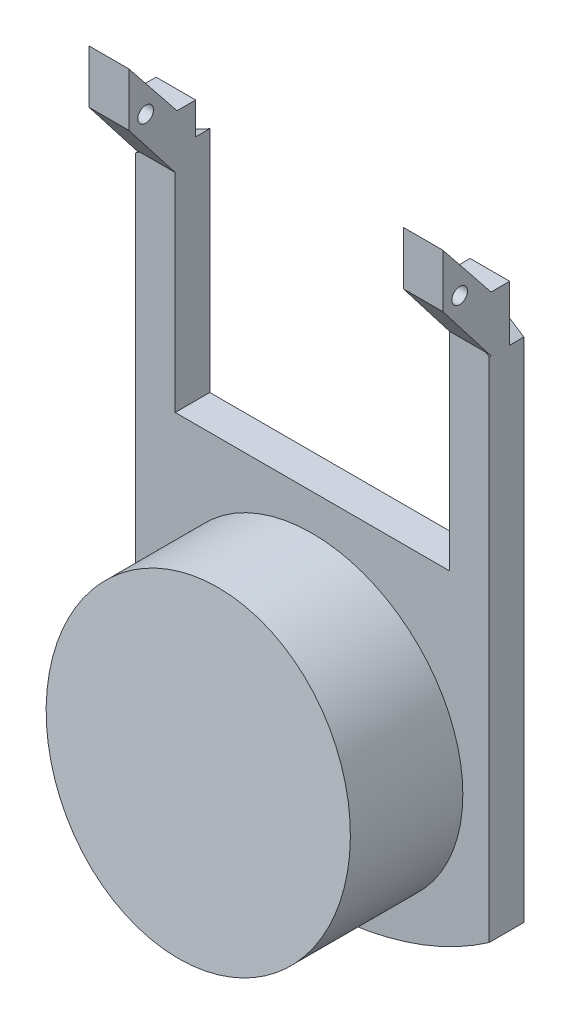
ISO-10303-21;
HEADER;
FILE_DESCRIPTION(('STEP AP214'),'2;1');
FILE_NAME('part.step','',(''),(''),'','','');
FILE_SCHEMA(('AUTOMOTIVE_DESIGN { 1 0 10303 214 1 1 1 1 }'));
ENDSEC;
DATA;
#1=APPLICATION_CONTEXT('core data for automotive mechanical design processes');
#2=APPLICATION_PROTOCOL_DEFINITION('international standard','automotive_design',2000,#1);
#3=PRODUCT_CONTEXT('',#1,'mechanical');
#4=PRODUCT('Part','Part','',(#3));
#5=PRODUCT_RELATED_PRODUCT_CATEGORY('part','',(#4));
#6=PRODUCT_DEFINITION_FORMATION('','',#4);
#7=PRODUCT_DEFINITION_CONTEXT('part definition',#1,'design');
#8=PRODUCT_DEFINITION('design','',#6,#7);
#9=PRODUCT_DEFINITION_SHAPE('','',#8);
#10=(LENGTH_UNIT() NAMED_UNIT(*) SI_UNIT(.MILLI.,.METRE.));
#11=(NAMED_UNIT(*) PLANE_ANGLE_UNIT() SI_UNIT($,.RADIAN.));
#12=(NAMED_UNIT(*) SI_UNIT($,.STERADIAN.) SOLID_ANGLE_UNIT());
#13=UNCERTAINTY_MEASURE_WITH_UNIT(LENGTH_MEASURE(1.E-05),#10,'distance_accuracy_value','');
#14=(GEOMETRIC_REPRESENTATION_CONTEXT(3) GLOBAL_UNCERTAINTY_ASSIGNED_CONTEXT((#13)) GLOBAL_UNIT_ASSIGNED_CONTEXT((#10,
#11,#12)) REPRESENTATION_CONTEXT('',''));
#15=CARTESIAN_POINT('',(0.,0.,0.));
#16=DIRECTION('',(0.,0.,1.));
#17=DIRECTION('',(1.,0.,0.));
#18=AXIS2_PLACEMENT_3D('',#15,#16,#17);
#19=CARTESIAN_POINT('',(14.097,6.0508127340824,3.556));
#20=DIRECTION('',(0.,0.,-1.));
#21=DIRECTION('',(-1.,0.,0.));
#22=AXIS2_PLACEMENT_3D('',#19,#20,#21);
#23=CYLINDRICAL_SURFACE('',#22,31.75);
#24=DIRECTION('',(0.,0.,-1.));
#25=VECTOR('',#24,1.);
#26=CARTESIAN_POINT('',(32.258,32.0938651473461,3.556));
#27=LINE('',#26,#25);
#28=CARTESIAN_POINT('',(32.258,32.0938651473461,3.556));
#29=VERTEX_POINT('',#28);
#30=CARTESIAN_POINT('',(32.258,32.0938651473461,3.36579521219438));
#31=VERTEX_POINT('',#30);
#32=EDGE_CURVE('E321',#29,#31,#27,.T.);
#33=ORIENTED_EDGE('',*,*,#32,.T.);
#34=CARTESIAN_POINT('',(14.097,6.0508127340824,-16.7318144543323));
#35=DIRECTION('',(0.,-0.610941706453606,0.791675584640297));
#36=DIRECTION('',(0.,-0.791675584640297,-0.610941706453606));
#37=AXIS2_PLACEMENT_3D('',#34,#35,#36);
#38=ELLIPSE('',#37,40.1048113848627,31.75);
#39=CARTESIAN_POINT('',(31.8993415970083,32.3403379040703,3.556));
#40=VERTEX_POINT('',#39);
#41=EDGE_CURVE('E223',#31,#40,#38,.T.);
#42=ORIENTED_EDGE('',*,*,#41,.T.);
#43=CARTESIAN_POINT('',(14.097,6.0508127340824,3.556));
#44=DIRECTION('',(0.,0.,1.));
#45=DIRECTION('',(1.,0.,0.));
#46=AXIS2_PLACEMENT_3D('',#43,#44,#45);
#47=CIRCLE('',#46,31.75);
#48=EDGE_CURVE('E284',#29,#40,#47,.T.);
#49=ORIENTED_EDGE('',*,*,#48,.F.);
#50=EDGE_LOOP('',(#33,#42,#49));
#51=FACE_BOUND('',#50,.T.);
#52=ADVANCED_FACE('F36',(#51),#23,.T.);
#53=CARTESIAN_POINT('',(14.097,6.0508127340824,3.556));
#54=DIRECTION('',(0.,0.,-1.));
#55=DIRECTION('',(-1.,0.,0.));
#56=AXIS2_PLACEMENT_3D('',#53,#54,#55);
#57=CYLINDRICAL_SURFACE('',#56,31.75);
#58=CARTESIAN_POINT('',(14.097,6.0508127340824,3.556));
#59=DIRECTION('',(0.,0.,1.));
#60=DIRECTION('',(1.,0.,0.));
#61=AXIS2_PLACEMENT_3D('',#58,#59,#60);
#62=CIRCLE('',#61,31.75);
#63=CARTESIAN_POINT('',(-3.64219577134326,32.3829876041146,3.556));
#64=VERTEX_POINT('',#63);
#65=CARTESIAN_POINT('',(-4.064,32.0938651473461,3.556));
#66=VERTEX_POINT('',#65);
#67=EDGE_CURVE('E294',#64,#66,#62,.T.);
#68=ORIENTED_EDGE('',*,*,#67,.F.);
#69=CARTESIAN_POINT('',(14.097,6.0508127340824,-16.9060538690415));
#70=DIRECTION('',(0.,-0.613594400594107,0.789621372278865));
#71=DIRECTION('',(0.,-0.789621372278866,-0.613594400594107));
#72=AXIS2_PLACEMENT_3D('',#69,#70,#71);
#73=ELLIPSE('',#72,40.2091446795174,31.75);
#74=CARTESIAN_POINT('',(-4.00023265049579,32.138217173655,3.36579521219438));
#75=VERTEX_POINT('',#74);
#76=EDGE_CURVE('E265',#64,#75,#73,.T.);
#77=ORIENTED_EDGE('',*,*,#76,.T.);
#78=CARTESIAN_POINT('',(14.097,6.0508127340824,3.36579521219438));
#79=DIRECTION('',(0.,0.,1.));
#80=DIRECTION('',(1.,0.,0.));
#81=AXIS2_PLACEMENT_3D('',#78,#79,#80);
#82=CIRCLE('',#81,31.75);
#83=CARTESIAN_POINT('',(-4.064,32.0938651473461,3.36579521219438));
#84=VERTEX_POINT('',#83);
#85=EDGE_CURVE('E269',#75,#84,#82,.T.);
#86=ORIENTED_EDGE('',*,*,#85,.T.);
#87=DIRECTION('',(0.,0.,-1.));
#88=VECTOR('',#87,1.);
#89=CARTESIAN_POINT('',(-4.064,32.0938651473461,3.556));
#90=LINE('',#89,#88);
#91=EDGE_CURVE('E330',#66,#84,#90,.T.);
#92=ORIENTED_EDGE('',*,*,#91,.F.);
#93=EDGE_LOOP('',(#68,#77,#86,#92));
#94=FACE_BOUND('',#93,.T.);
#95=ADVANCED_FACE('F373',(#94),#57,.T.);
#96=DIRECTION('',(0.,0.,-1.));
#97=VECTOR('',#96,1.);
#98=CARTESIAN_POINT('',(28.194,34.4996631677994,3.556));
#99=LINE('',#98,#97);
#100=CARTESIAN_POINT('',(28.194,34.4996631677994,1.47898621415967));
#101=VERTEX_POINT('',#100);
#102=CARTESIAN_POINT('',(28.194,34.4996631677994,0.));
#103=VERTEX_POINT('',#102);
#104=EDGE_CURVE('E51',#101,#103,#99,.T.);
#105=ORIENTED_EDGE('',*,*,#104,.F.);
#106=CARTESIAN_POINT('',(14.097,6.0508127340824,1.68586371234564));
#107=DIRECTION('',(0.,-0.00727171837656693,-0.999973560706408));
#108=DIRECTION('',(0.,0.999973560706408,-0.00727171837656693));
#109=AXIS2_PLACEMENT_3D('',#106,#107,#108);
#110=ELLIPSE('',#109,31.7508394697665,31.75);
#111=CARTESIAN_POINT('',(32.258,32.0938651473461,1.49648096238409));
#112=VERTEX_POINT('',#111);
#113=EDGE_CURVE('E55',#101,#112,#110,.T.);
#114=ORIENTED_EDGE('',*,*,#113,.T.);
#115=CARTESIAN_POINT('',(32.258,32.0938651473461,0.));
#116=VERTEX_POINT('',#115);
#117=EDGE_CURVE('E302',#112,#116,#27,.T.);
#118=ORIENTED_EDGE('',*,*,#117,.T.);
#119=CARTESIAN_POINT('',(14.097,6.0508127340824,0.));
#120=DIRECTION('',(0.,0.,1.));
#121=DIRECTION('',(1.,0.,0.));
#122=AXIS2_PLACEMENT_3D('',#119,#120,#121);
#123=CIRCLE('',#122,31.75);
#124=EDGE_CURVE('E283',#116,#103,#123,.T.);
#125=ORIENTED_EDGE('',*,*,#124,.T.);
#126=EDGE_LOOP('',(#105,#114,#118,#125));
#127=FACE_BOUND('',#126,.T.);
#128=ADVANCED_FACE('F38',(#127),#23,.T.);
#129=CARTESIAN_POINT('',(28.194,11.0322423654467,3.556));
#130=DIRECTION('',(1.,0.,0.));
#131=DIRECTION('',(0.,0.,-1.));
#132=AXIS2_PLACEMENT_3D('',#129,#130,#131);
#133=PLANE('',#132);
#134=CARTESIAN_POINT('',(28.194,39.0826970216145,6.58685865334384));
#135=DIRECTION('',(1.,0.,0.));
#136=DIRECTION('',(0.,0.,-1.));
#137=AXIS2_PLACEMENT_3D('',#134,#135,#136);
#138=CIRCLE('',#137,0.803296427959981);
#139=CARTESIAN_POINT('',(28.194,39.0826970216145,5.78356222538386));
#140=VERTEX_POINT('',#139);
#141=EDGE_CURVE('E202',#140,#140,#138,.T.);
#142=ORIENTED_EDGE('',*,*,#141,.T.);
#143=EDGE_LOOP('',(#142));
#144=FACE_BOUND('',#143,.T.);
#145=DIRECTION('',(0.,-0.999973560706408,0.00727171837656693));
#146=VECTOR('',#145,1.);
#147=CARTESIAN_POINT('',(28.194,26.6263546687254,1.53624021001197));
#148=LINE('',#147,#146);
#149=CARTESIAN_POINT('',(28.194,37.7822807676453,1.45511531230584));
#150=VERTEX_POINT('',#149);
#151=EDGE_CURVE('E198',#150,#101,#148,.T.);
#152=ORIENTED_EDGE('',*,*,#151,.T.);
#153=ORIENTED_EDGE('',*,*,#104,.T.);
#154=DIRECTION('',(0.,-1.,0.));
#155=VECTOR('',#154,1.);
#156=CARTESIAN_POINT('',(28.194,11.0322423654467,0.));
#157=LINE('',#156,#155);
#158=CARTESIAN_POINT('',(28.194,11.0322423654467,0.));
#159=VERTEX_POINT('',#158);
#160=EDGE_CURVE('E304',#103,#159,#157,.T.);
#161=ORIENTED_EDGE('',*,*,#160,.T.);
#162=DIRECTION('',(0.,0.,-1.));
#163=VECTOR('',#162,1.);
#164=CARTESIAN_POINT('',(28.194,11.0322423654467,3.556));
#165=LINE('',#164,#163);
#166=CARTESIAN_POINT('',(28.194,11.0322423654467,3.556));
#167=VERTEX_POINT('',#166);
#168=EDGE_CURVE('E338',#167,#159,#165,.T.);
#169=ORIENTED_EDGE('',*,*,#168,.F.);
#170=DIRECTION('',(0.,-1.,0.));
#171=VECTOR('',#170,1.);
#172=CARTESIAN_POINT('',(28.194,21.5456631677994,3.556));
#173=LINE('',#172,#171);
#174=CARTESIAN_POINT('',(28.194,32.3403379040703,3.556));
#175=VERTEX_POINT('',#174);
#176=EDGE_CURVE('E287',#175,#167,#173,.T.);
#177=ORIENTED_EDGE('',*,*,#176,.F.);
#178=DIRECTION('',(0.,0.791675584640297,0.610941706453606));
#179=VECTOR('',#178,1.);
#180=CARTESIAN_POINT('',(28.194,38.5154110159254,8.32134805118012));
#181=LINE('',#180,#179);
#182=CARTESIAN_POINT('',(28.194,38.5154110159254,8.32134805118012));
#183=VERTEX_POINT('',#182);
#184=EDGE_CURVE('E211',#175,#183,#181,.T.);
#185=ORIENTED_EDGE('',*,*,#184,.T.);
#186=DIRECTION('',(0.,1.,0.));
#187=VECTOR('',#186,1.);
#188=CARTESIAN_POINT('',(28.194,43.9841745875889,8.32134805118012));
#189=LINE('',#188,#187);
#190=CARTESIAN_POINT('',(28.194,43.9841745875889,8.32134805118012));
#191=VERTEX_POINT('',#190);
#192=EDGE_CURVE('E189',#183,#191,#189,.T.);
#193=ORIENTED_EDGE('',*,*,#192,.T.);
#194=DIRECTION('',(0.,-0.781235037898434,-0.624236986696425));
#195=VECTOR('',#194,1.);
#196=CARTESIAN_POINT('',(28.194,37.7822807676453,3.36579521219438));
#197=LINE('',#196,#195);
#198=CARTESIAN_POINT('',(28.194,37.7822807676453,3.36579521219438));
#199=VERTEX_POINT('',#198);
#200=EDGE_CURVE('E183',#191,#199,#197,.T.);
#201=ORIENTED_EDGE('',*,*,#200,.T.);
#202=DIRECTION('',(0.,0.,-1.));
#203=VECTOR('',#202,1.);
#204=CARTESIAN_POINT('',(28.194,37.7822807676453,1.45511531230584));
#205=LINE('',#204,#203);
#206=EDGE_CURVE('E192',#199,#150,#205,.T.);
#207=ORIENTED_EDGE('',*,*,#206,.T.);
#208=EDGE_LOOP('',(#152,#153,#161,#169,#177,#185,#193,#201,#207));
#209=FACE_BOUND('',#208,.T.);
#210=ADVANCED_FACE('F200',(#144,#209),#133,.F.);
#211=CARTESIAN_POINT('',(0.,11.0322423654467,3.556));
#212=DIRECTION('',(0.,-1.,0.));
#213=DIRECTION('',(0.,0.,-1.));
#214=AXIS2_PLACEMENT_3D('',#211,#212,#213);
#215=PLANE('',#214);
#216=DIRECTION('',(-1.,0.,0.));
#217=VECTOR('',#216,1.);
#218=CARTESIAN_POINT('',(0.,11.0322423654467,0.));
#219=LINE('',#218,#217);
#220=CARTESIAN_POINT('',(0.,11.0322423654467,0.));
#221=VERTEX_POINT('',#220);
#222=EDGE_CURVE('E306',#159,#221,#219,.T.);
#223=ORIENTED_EDGE('',*,*,#222,.T.);
#224=DIRECTION('',(0.,0.,-1.));
#225=VECTOR('',#224,1.);
#226=CARTESIAN_POINT('',(0.,11.0322423654467,3.556));
#227=LINE('',#226,#225);
#228=CARTESIAN_POINT('',(0.,11.0322423654467,3.556));
#229=VERTEX_POINT('',#228);
#230=EDGE_CURVE('E335',#229,#221,#227,.T.);
#231=ORIENTED_EDGE('',*,*,#230,.F.);
#232=DIRECTION('',(-1.,0.,0.));
#233=VECTOR('',#232,1.);
#234=CARTESIAN_POINT('',(0.,11.0322423654467,3.556));
#235=LINE('',#234,#233);
#236=EDGE_CURVE('E290',#167,#229,#235,.T.);
#237=ORIENTED_EDGE('',*,*,#236,.F.);
#238=ORIENTED_EDGE('',*,*,#168,.T.);
#239=EDGE_LOOP('',(#223,#231,#237,#238));
#240=FACE_BOUND('',#239,.T.);
#241=ADVANCED_FACE('F403',(#240),#215,.F.);
#242=CARTESIAN_POINT('',(0.,34.4996631677994,3.556));
#243=DIRECTION('',(-1.,0.,0.));
#244=DIRECTION('',(0.,-1.,0.));
#245=AXIS2_PLACEMENT_3D('',#242,#243,#244);
#246=PLANE('',#245);
#247=CARTESIAN_POINT('',(0.,39.0826970216144,6.58685865334384));
#248=DIRECTION('',(-1.,0.,0.));
#249=DIRECTION('',(0.,-1.,0.));
#250=AXIS2_PLACEMENT_3D('',#247,#248,#249);
#251=CIRCLE('',#250,0.803296427959981);
#252=CARTESIAN_POINT('',(0.,38.2794005936545,6.58685865334384));
#253=VERTEX_POINT('',#252);
#254=EDGE_CURVE('E205',#253,#253,#251,.T.);
#255=ORIENTED_EDGE('',*,*,#254,.T.);
#256=EDGE_LOOP('',(#255));
#257=FACE_BOUND('',#256,.T.);
#258=DIRECTION('',(0.,-0.789621372278866,-0.613594400594107));
#259=VECTOR('',#258,1.);
#260=CARTESIAN_POINT('',(0.,32.138217173655,3.36579521219438));
#261=LINE('',#260,#259);
#262=CARTESIAN_POINT('',(0.,38.5154110159254,8.32134805118012));
#263=VERTEX_POINT('',#262);
#264=CARTESIAN_POINT('',(0.,32.3829876041147,3.556));
#265=VERTEX_POINT('',#264);
#266=EDGE_CURVE('E227',#263,#265,#261,.T.);
#267=ORIENTED_EDGE('',*,*,#266,.T.);
#268=DIRECTION('',(0.,1.,0.));
#269=VECTOR('',#268,1.);
#270=CARTESIAN_POINT('',(0.,21.5456631677994,3.556));
#271=LINE('',#270,#269);
#272=EDGE_CURVE('E292',#229,#265,#271,.T.);
#273=ORIENTED_EDGE('',*,*,#272,.F.);
#274=ORIENTED_EDGE('',*,*,#230,.T.);
#275=DIRECTION('',(0.,1.,0.));
#276=VECTOR('',#275,1.);
#277=CARTESIAN_POINT('',(0.,34.4996631677994,0.));
#278=LINE('',#277,#276);
#279=CARTESIAN_POINT('',(0.,34.4996631677994,0.));
#280=VERTEX_POINT('',#279);
#281=EDGE_CURVE('E309',#221,#280,#278,.T.);
#282=ORIENTED_EDGE('',*,*,#281,.T.);
#283=DIRECTION('',(0.,0.,-1.));
#284=VECTOR('',#283,1.);
#285=CARTESIAN_POINT('',(0.,34.4996631677994,3.556));
#286=LINE('',#285,#284);
#287=CARTESIAN_POINT('',(0.,34.4996631677994,1.45511531230584));
#288=VERTEX_POINT('',#287);
#289=EDGE_CURVE('E333',#288,#280,#286,.T.);
#290=ORIENTED_EDGE('',*,*,#289,.F.);
#291=DIRECTION('',(0.,1.,0.));
#292=VECTOR('',#291,1.);
#293=CARTESIAN_POINT('',(0.,37.7822807676453,1.45511531230584));
#294=LINE('',#293,#292);
#295=CARTESIAN_POINT('',(0.,37.7822807676453,1.45511531230584));
#296=VERTEX_POINT('',#295);
#297=EDGE_CURVE('E237',#288,#296,#294,.T.);
#298=ORIENTED_EDGE('',*,*,#297,.T.);
#299=DIRECTION('',(0.,0.,1.));
#300=VECTOR('',#299,1.);
#301=CARTESIAN_POINT('',(0.,37.7822807676453,3.36579521219438));
#302=LINE('',#301,#300);
#303=CARTESIAN_POINT('',(0.,37.7822807676453,3.36579521219438));
#304=VERTEX_POINT('',#303);
#305=EDGE_CURVE('E235',#296,#304,#302,.T.);
#306=ORIENTED_EDGE('',*,*,#305,.T.);
#307=DIRECTION('',(0.,0.781235037898434,0.624236986696425));
#308=VECTOR('',#307,1.);
#309=CARTESIAN_POINT('',(0.,43.9841745875889,8.32134805118012));
#310=LINE('',#309,#308);
#311=CARTESIAN_POINT('',(0.,43.9841745875889,8.32134805118012));
#312=VERTEX_POINT('',#311);
#313=EDGE_CURVE('E233',#304,#312,#310,.T.);
#314=ORIENTED_EDGE('',*,*,#313,.T.);
#315=DIRECTION('',(0.,-1.,0.));
#316=VECTOR('',#315,1.);
#317=CARTESIAN_POINT('',(0.,38.5154110159254,8.32134805118012));
#318=LINE('',#317,#316);
#319=EDGE_CURVE('E230',#312,#263,#318,.T.);
#320=ORIENTED_EDGE('',*,*,#319,.T.);
#321=EDGE_LOOP('',(#267,#273,#274,#282,#290,#298,#306,#314,#320));
#322=FACE_BOUND('',#321,.T.);
#323=ADVANCED_FACE('F352',(#257,#322),#246,.F.);
#324=CARTESIAN_POINT('',(-4.064,32.0938651473461,1.45511531230584));
#325=VERTEX_POINT('',#324);
#326=CARTESIAN_POINT('',(-4.064,32.0938651473461,0.));
#327=VERTEX_POINT('',#326);
#328=EDGE_CURVE('E329',#325,#327,#90,.T.);
#329=ORIENTED_EDGE('',*,*,#328,.F.);
#330=CARTESIAN_POINT('',(14.097,6.0508127340824,1.45511531230584));
#331=DIRECTION('',(0.,0.,-1.));
#332=DIRECTION('',(-1.,0.,0.));
#333=AXIS2_PLACEMENT_3D('',#330,#331,#332);
#334=CIRCLE('',#333,31.75);
#335=EDGE_CURVE('E267',#325,#288,#334,.T.);
#336=ORIENTED_EDGE('',*,*,#335,.T.);
#337=ORIENTED_EDGE('',*,*,#289,.T.);
#338=CARTESIAN_POINT('',(14.097,6.0508127340824,0.));
#339=DIRECTION('',(0.,0.,1.));
#340=DIRECTION('',(1.,0.,0.));
#341=AXIS2_PLACEMENT_3D('',#338,#339,#340);
#342=CIRCLE('',#341,31.75);
#343=EDGE_CURVE('E312',#280,#327,#342,.T.);
#344=ORIENTED_EDGE('',*,*,#343,.T.);
#345=EDGE_LOOP('',(#329,#336,#337,#344));
#346=FACE_BOUND('',#345,.T.);
#347=ADVANCED_FACE('F413',(#346),#57,.T.);
#348=CARTESIAN_POINT('',(-4.064,32.0938651473461,3.556));
#349=DIRECTION('',(1.,0.,0.));
#350=DIRECTION('',(0.,1.,0.));
#351=AXIS2_PLACEMENT_3D('',#348,#349,#350);
#352=PLANE('',#351);
#353=CARTESIAN_POINT('',(-4.064,39.0826970216144,6.58685865334384));
#354=DIRECTION('',(-1.,0.,0.));
#355=DIRECTION('',(0.,-1.,0.));
#356=AXIS2_PLACEMENT_3D('',#353,#354,#355);
#357=CIRCLE('',#356,0.803296427959981);
#358=CARTESIAN_POINT('',(-4.064,38.2794005936545,6.58685865334384));
#359=VERTEX_POINT('',#358);
#360=EDGE_CURVE('E577',#359,#359,#357,.T.);
#361=ORIENTED_EDGE('',*,*,#360,.F.);
#362=EDGE_LOOP('',(#361));
#363=FACE_BOUND('',#362,.T.);
#364=ORIENTED_EDGE('',*,*,#91,.T.);
#365=DIRECTION('',(0.,1.,0.));
#366=VECTOR('',#365,1.);
#367=CARTESIAN_POINT('',(-4.064,28.8975629550318,3.36579521219438));
#368=LINE('',#367,#366);
#369=CARTESIAN_POINT('',(-4.064,32.138217173655,3.36579521219438));
#370=VERTEX_POINT('',#369);
#371=EDGE_CURVE('E243',#84,#370,#368,.T.);
#372=ORIENTED_EDGE('',*,*,#371,.T.);
#373=DIRECTION('',(0.,0.789621372278866,0.613594400594107));
#374=VECTOR('',#373,1.);
#375=CARTESIAN_POINT('',(-4.064,32.138217173655,3.36579521219438));
#376=LINE('',#375,#374);
#377=CARTESIAN_POINT('',(-4.064,38.5154110159254,8.32134805118012));
#378=VERTEX_POINT('',#377);
#379=EDGE_CURVE('E245',#370,#378,#376,.T.);
#380=ORIENTED_EDGE('',*,*,#379,.T.);
#381=DIRECTION('',(0.,1.,0.));
#382=VECTOR('',#381,1.);
#383=CARTESIAN_POINT('',(-4.064,38.5154110159254,8.32134805118012));
#384=LINE('',#383,#382);
#385=CARTESIAN_POINT('',(-4.064,43.9841745875889,8.32134805118012));
#386=VERTEX_POINT('',#385);
#387=EDGE_CURVE('E248',#378,#386,#384,.T.);
#388=ORIENTED_EDGE('',*,*,#387,.T.);
#389=DIRECTION('',(0.,-0.781235037898434,-0.624236986696425));
#390=VECTOR('',#389,1.);
#391=CARTESIAN_POINT('',(-4.064,43.9841745875889,8.32134805118012));
#392=LINE('',#391,#390);
#393=CARTESIAN_POINT('',(-4.064,37.7822807676453,3.36579521219438));
#394=VERTEX_POINT('',#393);
#395=EDGE_CURVE('E251',#386,#394,#392,.T.);
#396=ORIENTED_EDGE('',*,*,#395,.T.);
#397=DIRECTION('',(0.,0.,-1.));
#398=VECTOR('',#397,1.);
#399=CARTESIAN_POINT('',(-4.064,37.7822807676453,3.36579521219438));
#400=LINE('',#399,#398);
#401=CARTESIAN_POINT('',(-4.064,37.7822807676453,1.45511531230584));
#402=VERTEX_POINT('',#401);
#403=EDGE_CURVE('E226',#394,#402,#400,.T.);
#404=ORIENTED_EDGE('',*,*,#403,.T.);
#405=DIRECTION('',(0.,-1.,0.));
#406=VECTOR('',#405,1.);
#407=CARTESIAN_POINT('',(-4.064,37.7822807676453,1.45511531230584));
#408=LINE('',#407,#406);
#409=EDGE_CURVE('E240',#402,#325,#408,.T.);
#410=ORIENTED_EDGE('',*,*,#409,.T.);
#411=ORIENTED_EDGE('',*,*,#328,.T.);
#412=DIRECTION('',(0.,-1.,0.));
#413=VECTOR('',#412,1.);
#414=CARTESIAN_POINT('',(-4.064,32.0938651473461,0.));
#415=LINE('',#414,#413);
#416=CARTESIAN_POINT('',(-4.06399999999999,-19.9922396791813,0.));
#417=VERTEX_POINT('',#416);
#418=EDGE_CURVE('E315',#327,#417,#415,.T.);
#419=ORIENTED_EDGE('',*,*,#418,.T.);
#420=DIRECTION('',(0.,0.,-1.));
#421=VECTOR('',#420,1.);
#422=CARTESIAN_POINT('',(-4.06399999999999,-19.9922396791813,3.556));
#423=LINE('',#422,#421);
#424=CARTESIAN_POINT('',(-4.06399999999999,-19.9922396791813,3.556));
#425=VERTEX_POINT('',#424);
#426=EDGE_CURVE('E326',#425,#417,#423,.T.);
#427=ORIENTED_EDGE('',*,*,#426,.F.);
#428=DIRECTION('',(0.,-1.,0.));
#429=VECTOR('',#428,1.);
#430=CARTESIAN_POINT('',(-4.064,32.0938651473461,3.556));
#431=LINE('',#430,#429);
#432=EDGE_CURVE('E296',#66,#425,#431,.T.);
#433=ORIENTED_EDGE('',*,*,#432,.F.);
#434=EDGE_LOOP('',(#364,#372,#380,#388,#396,#404,#410,#411,#419,#427,#433));
#435=FACE_BOUND('',#434,.T.);
#436=ADVANCED_FACE('F365',(#363,#435),#352,.F.);
#437=CARTESIAN_POINT('',(14.097,6.0508127340824,3.556));
#438=DIRECTION('',(0.,0.,-1.));
#439=DIRECTION('',(-1.,0.,0.));
#440=AXIS2_PLACEMENT_3D('',#437,#438,#439);
#441=CYLINDRICAL_SURFACE('',#440,31.75);
#442=CARTESIAN_POINT('',(14.097,6.0508127340824,0.));
#443=DIRECTION('',(0.,0.,1.));
#444=DIRECTION('',(1.,0.,0.));
#445=AXIS2_PLACEMENT_3D('',#442,#443,#444);
#446=CIRCLE('',#445,31.75);
#447=CARTESIAN_POINT('',(32.258,-19.9922396791813,0.));
#448=VERTEX_POINT('',#447);
#449=EDGE_CURVE('E317',#417,#448,#446,.T.);
#450=ORIENTED_EDGE('',*,*,#449,.T.);
#451=DIRECTION('',(0.,0.,-1.));
#452=VECTOR('',#451,1.);
#453=CARTESIAN_POINT('',(32.258,-19.9922396791813,3.556));
#454=LINE('',#453,#452);
#455=CARTESIAN_POINT('',(32.258,-19.9922396791813,3.556));
#456=VERTEX_POINT('',#455);
#457=EDGE_CURVE('E323',#456,#448,#454,.T.);
#458=ORIENTED_EDGE('',*,*,#457,.F.);
#459=CARTESIAN_POINT('',(14.097,6.0508127340824,3.556));
#460=DIRECTION('',(0.,0.,1.));
#461=DIRECTION('',(1.,0.,0.));
#462=AXIS2_PLACEMENT_3D('',#459,#460,#461);
#463=CIRCLE('',#462,31.75);
#464=EDGE_CURVE('E298',#425,#456,#463,.T.);
#465=ORIENTED_EDGE('',*,*,#464,.F.);
#466=ORIENTED_EDGE('',*,*,#426,.T.);
#467=EDGE_LOOP('',(#450,#458,#465,#466));
#468=FACE_BOUND('',#467,.T.);
#469=ADVANCED_FACE('F384',(#468),#441,.T.);
#470=CARTESIAN_POINT('',(32.258,32.0938651473461,3.556));
#471=DIRECTION('',(-1.,0.,0.));
#472=DIRECTION('',(0.,-1.,0.));
#473=AXIS2_PLACEMENT_3D('',#470,#471,#472);
#474=PLANE('',#473);
#475=CARTESIAN_POINT('',(32.258,39.0826970216145,6.58685865334384));
#476=DIRECTION('',(-1.,0.,0.));
#477=DIRECTION('',(0.,-1.,0.));
#478=AXIS2_PLACEMENT_3D('',#475,#476,#477);
#479=CIRCLE('',#478,0.803296427959981);
#480=CARTESIAN_POINT('',(32.258,38.2794005936545,6.58685865334384));
#481=VERTEX_POINT('',#480);
#482=EDGE_CURVE('E580',#481,#481,#479,.F.);
#483=ORIENTED_EDGE('',*,*,#482,.F.);
#484=EDGE_LOOP('',(#483));
#485=FACE_BOUND('',#484,.T.);
#486=ORIENTED_EDGE('',*,*,#117,.F.);
#487=DIRECTION('',(0.,0.999973560706408,-0.00727171837656693));
#488=VECTOR('',#487,1.);
#489=CARTESIAN_POINT('',(32.258,26.6263546687254,1.53624021001197));
#490=LINE('',#489,#488);
#491=CARTESIAN_POINT('',(32.258,37.7822807676453,1.45511531230584));
#492=VERTEX_POINT('',#491);
#493=EDGE_CURVE('E216',#112,#492,#490,.T.);
#494=ORIENTED_EDGE('',*,*,#493,.T.);
#495=DIRECTION('',(0.,0.,1.));
#496=VECTOR('',#495,1.);
#497=CARTESIAN_POINT('',(32.258,37.7822807676453,1.45511531230584));
#498=LINE('',#497,#496);
#499=CARTESIAN_POINT('',(32.258,37.7822807676453,3.36579521219438));
#500=VERTEX_POINT('',#499);
#501=EDGE_CURVE('E221',#492,#500,#498,.T.);
#502=ORIENTED_EDGE('',*,*,#501,.T.);
#503=DIRECTION('',(0.,0.781235037898434,0.624236986696425));
#504=VECTOR('',#503,1.);
#505=CARTESIAN_POINT('',(32.258,37.7822807676453,3.36579521219438));
#506=LINE('',#505,#504);
#507=CARTESIAN_POINT('',(32.258,43.9841745875889,8.32134805118012));
#508=VERTEX_POINT('',#507);
#509=EDGE_CURVE('E185',#500,#508,#506,.T.);
#510=ORIENTED_EDGE('',*,*,#509,.T.);
#511=DIRECTION('',(0.,-1.,0.));
#512=VECTOR('',#511,1.);
#513=CARTESIAN_POINT('',(32.258,43.9841745875888,8.32134805118012));
#514=LINE('',#513,#512);
#515=CARTESIAN_POINT('',(32.258,38.5154110159254,8.32134805118012));
#516=VERTEX_POINT('',#515);
#517=EDGE_CURVE('E424',#508,#516,#514,.T.);
#518=ORIENTED_EDGE('',*,*,#517,.T.);
#519=DIRECTION('',(0.,-0.791675584640297,-0.610941706453606));
#520=VECTOR('',#519,1.);
#521=CARTESIAN_POINT('',(32.258,38.5154110159254,8.32134805118012));
#522=LINE('',#521,#520);
#523=EDGE_CURVE('E392',#516,#31,#522,.T.);
#524=ORIENTED_EDGE('',*,*,#523,.T.);
#525=ORIENTED_EDGE('',*,*,#32,.F.);
#526=DIRECTION('',(0.,1.,0.));
#527=VECTOR('',#526,1.);
#528=CARTESIAN_POINT('',(32.258,32.0938651473461,3.556));
#529=LINE('',#528,#527);
#530=EDGE_CURVE('E300',#456,#29,#529,.T.);
#531=ORIENTED_EDGE('',*,*,#530,.F.);
#532=ORIENTED_EDGE('',*,*,#457,.T.);
#533=DIRECTION('',(0.,1.,0.));
#534=VECTOR('',#533,1.);
#535=CARTESIAN_POINT('',(32.258,32.0938651473461,0.));
#536=LINE('',#535,#534);
#537=EDGE_CURVE('E288',#448,#116,#536,.T.);
#538=ORIENTED_EDGE('',*,*,#537,.T.);
#539=EDGE_LOOP('',(#486,#494,#502,#510,#518,#524,#525,#531,#532,#538));
#540=FACE_BOUND('',#539,.T.);
#541=ADVANCED_FACE('F388',(#485,#540),#474,.F.);
#542=CARTESIAN_POINT('',(14.097,6.0508127340824,3.556));
#543=DIRECTION('',(0.,0.,1.));
#544=DIRECTION('',(1.,0.,0.));
#545=AXIS2_PLACEMENT_3D('',#542,#543,#544);
#546=PLANE('',#545);
#547=DIRECTION('',(1.,0.,0.));
#548=VECTOR('',#547,1.);
#549=CARTESIAN_POINT('',(14.097,32.3403379040703,3.556));
#550=LINE('',#549,#548);
#551=EDGE_CURVE('E11',#175,#40,#550,.T.);
#552=ORIENTED_EDGE('',*,*,#551,.F.);
#553=ORIENTED_EDGE('',*,*,#176,.T.);
#554=ORIENTED_EDGE('',*,*,#236,.T.);
#555=ORIENTED_EDGE('',*,*,#272,.T.);
#556=DIRECTION('',(1.,0.,0.));
#557=VECTOR('',#556,1.);
#558=CARTESIAN_POINT('',(14.097,32.3829876041146,3.556));
#559=LINE('',#558,#557);
#560=EDGE_CURVE('E44',#64,#265,#559,.T.);
#561=ORIENTED_EDGE('',*,*,#560,.F.);
#562=ORIENTED_EDGE('',*,*,#67,.T.);
#563=ORIENTED_EDGE('',*,*,#432,.T.);
#564=ORIENTED_EDGE('',*,*,#464,.T.);
#565=ORIENTED_EDGE('',*,*,#530,.T.);
#566=ORIENTED_EDGE('',*,*,#48,.T.);
#567=EDGE_LOOP('',(#552,#553,#554,#555,#561,#562,#563,#564,#565,#566));
#568=FACE_BOUND('',#567,.T.);
#569=CARTESIAN_POINT('',(14.0541859909063,-8.1731872659176,3.556));
#570=DIRECTION('',(0.,0.,1.));
#571=DIRECTION('',(1.,0.,0.));
#572=AXIS2_PLACEMENT_3D('',#569,#570,#571);
#573=CIRCLE('',#572,15.494);
#574=CARTESIAN_POINT('',(29.5481859909063,-8.1731872659176,3.556));
#575=VERTEX_POINT('',#574);
#576=EDGE_CURVE('E278',#575,#575,#573,.T.);
#577=ORIENTED_EDGE('',*,*,#576,.F.);
#578=EDGE_LOOP('',(#577));
#579=FACE_BOUND('',#578,.T.);
#580=ADVANCED_FACE('F378',(#568,#579),#546,.T.);
#581=CARTESIAN_POINT('',(14.097,6.0508127340824,0.));
#582=DIRECTION('',(0.,0.,1.));
#583=DIRECTION('',(1.,0.,0.));
#584=AXIS2_PLACEMENT_3D('',#581,#582,#583);
#585=PLANE('',#584);
#586=CARTESIAN_POINT('',(14.097,-8.1731872659176,0.));
#587=DIRECTION('',(0.,0.,-1.));
#588=DIRECTION('',(-1.,0.,0.));
#589=AXIS2_PLACEMENT_3D('',#586,#587,#588);
#590=CIRCLE('',#589,13.589);
#591=CARTESIAN_POINT('',(0.507999999999995,-8.1731872659176,0.));
#592=VERTEX_POINT('',#591);
#593=EDGE_CURVE('E274',#592,#592,#590,.T.);
#594=ORIENTED_EDGE('',*,*,#593,.F.);
#595=EDGE_LOOP('',(#594));
#596=FACE_BOUND('',#595,.T.);
#597=ORIENTED_EDGE('',*,*,#124,.F.);
#598=ORIENTED_EDGE('',*,*,#537,.F.);
#599=ORIENTED_EDGE('',*,*,#449,.F.);
#600=ORIENTED_EDGE('',*,*,#418,.F.);
#601=ORIENTED_EDGE('',*,*,#343,.F.);
#602=ORIENTED_EDGE('',*,*,#281,.F.);
#603=ORIENTED_EDGE('',*,*,#222,.F.);
#604=ORIENTED_EDGE('',*,*,#160,.F.);
#605=EDGE_LOOP('',(#597,#598,#599,#600,#601,#602,#603,#604));
#606=FACE_BOUND('',#605,.T.);
#607=ADVANCED_FACE('F411',(#596,#606),#585,.F.);
#608=CARTESIAN_POINT('',(14.0541859909063,-8.1731872659176,17.272));
#609=DIRECTION('',(0.,0.,-1.));
#610=DIRECTION('',(-1.,0.,0.));
#611=AXIS2_PLACEMENT_3D('',#608,#609,#610);
#612=CYLINDRICAL_SURFACE('',#611,15.494);
#613=CARTESIAN_POINT('',(14.0541859909063,-8.1731872659176,15.24));
#614=DIRECTION('',(0.,-0.130034036800186,-0.99150953060142));
#615=DIRECTION('',(0.,0.99150953060142,-0.130034036800186));
#616=AXIS2_PLACEMENT_3D('',#613,#614,#615);
#617=ELLIPSE('',#616,15.6266778299164,15.494);
#618=CARTESIAN_POINT('',(14.0541859909063,7.32081273408241,13.208));
#619=VERTEX_POINT('',#618);
#620=EDGE_CURVE('E271',#619,#619,#617,.T.);
#621=ORIENTED_EDGE('',*,*,#620,.T.);
#622=EDGE_LOOP('',(#621));
#623=FACE_BOUND('',#622,.T.);
#624=ORIENTED_EDGE('',*,*,#576,.T.);
#625=EDGE_LOOP('',(#624));
#626=FACE_BOUND('',#625,.T.);
#627=ADVANCED_FACE('F470',(#623,#626),#612,.T.);
#628=CARTESIAN_POINT('',(14.097,-8.1731872659176,12.7));
#629=DIRECTION('',(0.,0.,-1.));
#630=DIRECTION('',(-1.,0.,0.));
#631=AXIS2_PLACEMENT_3D('',#628,#629,#630);
#632=CYLINDRICAL_SURFACE('',#631,13.589);
#633=CARTESIAN_POINT('',(14.097,-8.1731872659176,12.7));
#634=DIRECTION('',(0.,0.,-1.));
#635=DIRECTION('',(-1.,0.,0.));
#636=AXIS2_PLACEMENT_3D('',#633,#634,#635);
#637=CIRCLE('',#636,13.589);
#638=CARTESIAN_POINT('',(0.507999999999995,-8.1731872659176,12.7));
#639=VERTEX_POINT('',#638);
#640=EDGE_CURVE('E275',#639,#639,#637,.T.);
#641=ORIENTED_EDGE('',*,*,#640,.F.);
#642=EDGE_LOOP('',(#641));
#643=FACE_BOUND('',#642,.T.);
#644=ORIENTED_EDGE('',*,*,#593,.T.);
#645=EDGE_LOOP('',(#644));
#646=FACE_BOUND('',#645,.T.);
#647=ADVANCED_FACE('F476',(#643,#646),#632,.F.);
#648=CARTESIAN_POINT('',(14.097,-8.1731872659176,12.7));
#649=DIRECTION('',(0.,0.,-1.));
#650=DIRECTION('',(-1.,0.,0.));
#651=AXIS2_PLACEMENT_3D('',#648,#649,#650);
#652=PLANE('',#651);
#653=ORIENTED_EDGE('',*,*,#640,.T.);
#654=EDGE_LOOP('',(#653));
#655=FACE_BOUND('',#654,.T.);
#656=ADVANCED_FACE('F480',(#655),#652,.T.);
#657=CARTESIAN_POINT('',(31.75,1.82669379523944,13.9285401887007));
#658=DIRECTION('',(0.,-0.130034036800186,-0.99150953060142));
#659=DIRECTION('',(0.,0.99150953060142,-0.130034036800186));
#660=AXIS2_PLACEMENT_3D('',#657,#658,#659);
#661=PLANE('',#660);
#662=ORIENTED_EDGE('',*,*,#620,.F.);
#663=EDGE_LOOP('',(#662));
#664=FACE_BOUND('',#663,.T.);
#665=ADVANCED_FACE('F484',(#664),#661,.F.);
#666=CARTESIAN_POINT('',(16.5756146967765,28.8975629550318,3.36579521219438));
#667=DIRECTION('',(0.,0.,1.));
#668=DIRECTION('',(1.,0.,0.));
#669=AXIS2_PLACEMENT_3D('',#666,#667,#668);
#670=PLANE('',#669);
#671=ORIENTED_EDGE('',*,*,#85,.F.);
#672=DIRECTION('',(-1.,0.,0.));
#673=VECTOR('',#672,1.);
#674=CARTESIAN_POINT('',(16.5756146967765,32.138217173655,3.36579521219438));
#675=LINE('',#674,#673);
#676=EDGE_CURVE('E260',#75,#370,#675,.T.);
#677=ORIENTED_EDGE('',*,*,#676,.T.);
#678=ORIENTED_EDGE('',*,*,#371,.F.);
#679=EDGE_LOOP('',(#671,#677,#678));
#680=FACE_BOUND('',#679,.T.);
#681=ADVANCED_FACE('F370',(#680),#670,.T.);
#682=CARTESIAN_POINT('',(16.5756146967765,37.7822807676453,1.45511531230584));
#683=DIRECTION('',(0.,0.,-1.));
#684=DIRECTION('',(-1.,0.,0.));
#685=AXIS2_PLACEMENT_3D('',#682,#683,#684);
#686=PLANE('',#685);
#687=ORIENTED_EDGE('',*,*,#335,.F.);
#688=ORIENTED_EDGE('',*,*,#409,.F.);
#689=DIRECTION('',(-1.,0.,0.));
#690=VECTOR('',#689,1.);
#691=CARTESIAN_POINT('',(16.5756146967765,37.7822807676453,1.45511531230584));
#692=LINE('',#691,#690);
#693=EDGE_CURVE('E254',#296,#402,#692,.T.);
#694=ORIENTED_EDGE('',*,*,#693,.F.);
#695=ORIENTED_EDGE('',*,*,#297,.F.);
#696=EDGE_LOOP('',(#687,#688,#694,#695));
#697=FACE_BOUND('',#696,.T.);
#698=ADVANCED_FACE('F417',(#697),#686,.T.);
#699=CARTESIAN_POINT('',(16.5756146967765,32.138217173655,3.36579521219438));
#700=DIRECTION('',(0.,-0.613594400594107,0.789621372278865));
#701=DIRECTION('',(0.,-0.789621372278866,-0.613594400594107));
#702=AXIS2_PLACEMENT_3D('',#699,#700,#701);
#703=PLANE('',#702);
#704=ORIENTED_EDGE('',*,*,#76,.F.);
#705=ORIENTED_EDGE('',*,*,#560,.T.);
#706=ORIENTED_EDGE('',*,*,#266,.F.);
#707=DIRECTION('',(-1.,0.,0.));
#708=VECTOR('',#707,1.);
#709=CARTESIAN_POINT('',(16.5756146967765,38.5154110159254,8.32134805118012));
#710=LINE('',#709,#708);
#711=EDGE_CURVE('E258',#263,#378,#710,.T.);
#712=ORIENTED_EDGE('',*,*,#711,.T.);
#713=ORIENTED_EDGE('',*,*,#379,.F.);
#714=ORIENTED_EDGE('',*,*,#676,.F.);
#715=EDGE_LOOP('',(#704,#705,#706,#712,#713,#714));
#716=FACE_BOUND('',#715,.T.);
#717=ADVANCED_FACE('F345',(#716),#703,.T.);
#718=CARTESIAN_POINT('',(16.5756146967765,37.7822807676453,3.36579521219438));
#719=DIRECTION('',(0.,1.,0.));
#720=DIRECTION('',(-1.,0.,0.));
#721=AXIS2_PLACEMENT_3D('',#718,#719,#720);
#722=PLANE('',#721);
#723=ORIENTED_EDGE('',*,*,#305,.F.);
#724=ORIENTED_EDGE('',*,*,#693,.T.);
#725=ORIENTED_EDGE('',*,*,#403,.F.);
#726=DIRECTION('',(-1.,0.,0.));
#727=VECTOR('',#726,1.);
#728=CARTESIAN_POINT('',(16.5756146967765,37.7822807676453,3.36579521219438));
#729=LINE('',#728,#727);
#730=EDGE_CURVE('E231',#304,#394,#729,.T.);
#731=ORIENTED_EDGE('',*,*,#730,.F.);
#732=EDGE_LOOP('',(#723,#724,#725,#731));
#733=FACE_BOUND('',#732,.T.);
#734=ADVANCED_FACE('F489',(#733),#722,.T.);
#735=CARTESIAN_POINT('',(16.5756146967765,43.9841745875889,8.32134805118012));
#736=DIRECTION('',(0.,0.624236986696425,-0.781235037898434));
#737=DIRECTION('',(0.,0.781235037898434,0.624236986696425));
#738=AXIS2_PLACEMENT_3D('',#735,#736,#737);
#739=PLANE('',#738);
#740=ORIENTED_EDGE('',*,*,#313,.F.);
#741=ORIENTED_EDGE('',*,*,#730,.T.);
#742=ORIENTED_EDGE('',*,*,#395,.F.);
#743=DIRECTION('',(-1.,0.,0.));
#744=VECTOR('',#743,1.);
#745=CARTESIAN_POINT('',(16.5756146967765,43.9841745875889,8.32134805118012));
#746=LINE('',#745,#744);
#747=EDGE_CURVE('E256',#312,#386,#746,.T.);
#748=ORIENTED_EDGE('',*,*,#747,.F.);
#749=EDGE_LOOP('',(#740,#741,#742,#748));
#750=FACE_BOUND('',#749,.T.);
#751=ADVANCED_FACE('F361',(#750),#739,.T.);
#752=CARTESIAN_POINT('',(16.5756146967765,38.5154110159254,8.32134805118012));
#753=DIRECTION('',(0.,0.,1.));
#754=DIRECTION('',(1.,0.,0.));
#755=AXIS2_PLACEMENT_3D('',#752,#753,#754);
#756=PLANE('',#755);
#757=ORIENTED_EDGE('',*,*,#319,.F.);
#758=ORIENTED_EDGE('',*,*,#747,.T.);
#759=ORIENTED_EDGE('',*,*,#387,.F.);
#760=ORIENTED_EDGE('',*,*,#711,.F.);
#761=EDGE_LOOP('',(#757,#758,#759,#760));
#762=FACE_BOUND('',#761,.T.);
#763=ADVANCED_FACE('F357',(#762),#756,.T.);
#764=CARTESIAN_POINT('',(50.9245225567078,26.6263546687254,1.53624021001197));
#765=DIRECTION('',(0.,-0.00727171837656693,-0.999973560706408));
#766=DIRECTION('',(0.,0.999973560706408,-0.00727171837656693));
#767=AXIS2_PLACEMENT_3D('',#764,#765,#766);
#768=PLANE('',#767);
#769=ORIENTED_EDGE('',*,*,#113,.F.);
#770=ORIENTED_EDGE('',*,*,#151,.F.);
#771=DIRECTION('',(-1.,0.,0.));
#772=VECTOR('',#771,1.);
#773=CARTESIAN_POINT('',(50.9245225567078,37.7822807676453,1.45511531230584));
#774=LINE('',#773,#772);
#775=EDGE_CURVE('E188',#492,#150,#774,.T.);
#776=ORIENTED_EDGE('',*,*,#775,.F.);
#777=ORIENTED_EDGE('',*,*,#493,.F.);
#778=EDGE_LOOP('',(#769,#770,#776,#777));
#779=FACE_BOUND('',#778,.T.);
#780=ADVANCED_FACE('F422',(#779),#768,.T.);
#781=CARTESIAN_POINT('',(50.9245225567078,38.5154110159254,8.32134805118012));
#782=DIRECTION('',(0.,-0.610941706453606,0.791675584640297));
#783=DIRECTION('',(0.,-0.791675584640297,-0.610941706453606));
#784=AXIS2_PLACEMENT_3D('',#781,#782,#783);
#785=PLANE('',#784);
#786=ORIENTED_EDGE('',*,*,#41,.F.);
#787=ORIENTED_EDGE('',*,*,#523,.F.);
#788=DIRECTION('',(-1.,0.,0.));
#789=VECTOR('',#788,1.);
#790=CARTESIAN_POINT('',(50.9245225567078,38.5154110159254,8.32134805118012));
#791=LINE('',#790,#789);
#792=EDGE_CURVE('E217',#516,#183,#791,.T.);
#793=ORIENTED_EDGE('',*,*,#792,.T.);
#794=ORIENTED_EDGE('',*,*,#184,.F.);
#795=ORIENTED_EDGE('',*,*,#551,.T.);
#796=EDGE_LOOP('',(#786,#787,#793,#794,#795));
#797=FACE_BOUND('',#796,.T.);
#798=ADVANCED_FACE('F397',(#797),#785,.T.);
#799=CARTESIAN_POINT('',(50.9245225567078,37.7822807676453,3.36579521219438));
#800=DIRECTION('',(0.,0.624236986696425,-0.781235037898434));
#801=DIRECTION('',(0.,0.781235037898434,0.624236986696425));
#802=AXIS2_PLACEMENT_3D('',#799,#800,#801);
#803=PLANE('',#802);
#804=ORIENTED_EDGE('',*,*,#509,.F.);
#805=DIRECTION('',(-1.,0.,0.));
#806=VECTOR('',#805,1.);
#807=CARTESIAN_POINT('',(50.9245225567078,37.7822807676453,3.36579521219438));
#808=LINE('',#807,#806);
#809=EDGE_CURVE('E178',#500,#199,#808,.T.);
#810=ORIENTED_EDGE('',*,*,#809,.T.);
#811=ORIENTED_EDGE('',*,*,#200,.F.);
#812=DIRECTION('',(-1.,0.,0.));
#813=VECTOR('',#812,1.);
#814=CARTESIAN_POINT('',(50.9245225567078,43.9841745875889,8.32134805118012));
#815=LINE('',#814,#813);
#816=EDGE_CURVE('E214',#508,#191,#815,.T.);
#817=ORIENTED_EDGE('',*,*,#816,.F.);
#818=EDGE_LOOP('',(#804,#810,#811,#817));
#819=FACE_BOUND('',#818,.T.);
#820=ADVANCED_FACE('F180',(#819),#803,.T.);
#821=CARTESIAN_POINT('',(50.9245225567078,43.9841745875889,8.32134805118012));
#822=DIRECTION('',(0.,0.,1.));
#823=DIRECTION('',(1.,0.,0.));
#824=AXIS2_PLACEMENT_3D('',#821,#822,#823);
#825=PLANE('',#824);
#826=ORIENTED_EDGE('',*,*,#517,.F.);
#827=ORIENTED_EDGE('',*,*,#816,.T.);
#828=ORIENTED_EDGE('',*,*,#192,.F.);
#829=ORIENTED_EDGE('',*,*,#792,.F.);
#830=EDGE_LOOP('',(#826,#827,#828,#829));
#831=FACE_BOUND('',#830,.T.);
#832=ADVANCED_FACE('F429',(#831),#825,.T.);
#833=CARTESIAN_POINT('',(50.9245225567078,37.7822807676453,1.45511531230584));
#834=DIRECTION('',(0.,1.,0.));
#835=DIRECTION('',(0.,0.,1.));
#836=AXIS2_PLACEMENT_3D('',#833,#834,#835);
#837=PLANE('',#836);
#838=ORIENTED_EDGE('',*,*,#501,.F.);
#839=ORIENTED_EDGE('',*,*,#775,.T.);
#840=ORIENTED_EDGE('',*,*,#206,.F.);
#841=ORIENTED_EDGE('',*,*,#809,.F.);
#842=EDGE_LOOP('',(#838,#839,#840,#841));
#843=FACE_BOUND('',#842,.T.);
#844=ADVANCED_FACE('F193',(#843),#837,.T.);
#845=CARTESIAN_POINT('',(34.5300654060537,39.0826970216145,6.58685865334384));
#846=DIRECTION('',(-1.,0.,0.));
#847=DIRECTION('',(0.,-1.,0.));
#848=AXIS2_PLACEMENT_3D('',#845,#846,#847);
#849=CYLINDRICAL_SURFACE('',#848,0.803296427959981);
#850=ORIENTED_EDGE('',*,*,#482,.T.);
#851=EDGE_LOOP('',(#850));
#852=FACE_BOUND('',#851,.T.);
#853=ORIENTED_EDGE('',*,*,#141,.F.);
#854=EDGE_LOOP('',(#853));
#855=FACE_BOUND('',#854,.T.);
#856=ADVANCED_FACE('F436',(#852,#855),#849,.F.);
#857=ORIENTED_EDGE('',*,*,#360,.T.);
#858=EDGE_LOOP('',(#857));
#859=FACE_BOUND('',#858,.T.);
#860=ORIENTED_EDGE('',*,*,#254,.F.);
#861=EDGE_LOOP('',(#860));
#862=FACE_BOUND('',#861,.T.);
#863=ADVANCED_FACE('F562',(#859,#862),#849,.F.);
#864=CLOSED_SHELL('',(#52,#95,#128,#210,#241,#323,#347,#436,#469,#541,#580,#607,#627,#647,#656,
#665,#681,#698,#717,#734,#751,#763,#780,#798,#820,#832,#844,#856,#863));
#865=MANIFOLD_SOLID_BREP('B2',#864);
#866=ADVANCED_BREP_SHAPE_REPRESENTATION('',(#18,#865),#14);
#867=SHAPE_DEFINITION_REPRESENTATION(#9,#866);
ENDSEC;
END-ISO-10303-21;
